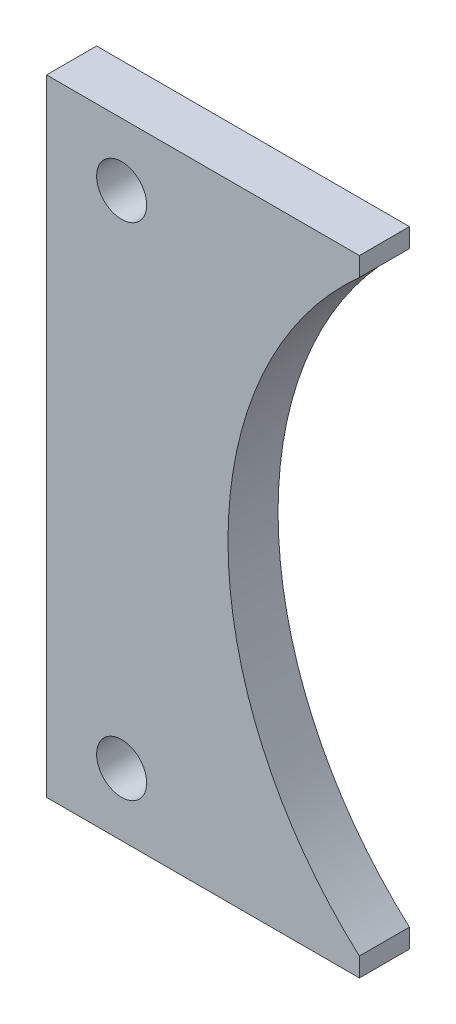
ISO-10303-21;
HEADER;
FILE_DESCRIPTION(('STEP AP214'),'2;1');
FILE_NAME('part.step','',(''),(''),'','','');
FILE_SCHEMA(('AUTOMOTIVE_DESIGN { 1 0 10303 214 1 1 1 1 }'));
ENDSEC;
DATA;
#1=APPLICATION_CONTEXT('core data for automotive mechanical design processes');
#2=APPLICATION_PROTOCOL_DEFINITION('international standard','automotive_design',2000,#1);
#3=PRODUCT_CONTEXT('',#1,'mechanical');
#4=PRODUCT('Part','Part','',(#3));
#5=PRODUCT_RELATED_PRODUCT_CATEGORY('part','',(#4));
#6=PRODUCT_DEFINITION_FORMATION('','',#4);
#7=PRODUCT_DEFINITION_CONTEXT('part definition',#1,'design');
#8=PRODUCT_DEFINITION('design','',#6,#7);
#9=PRODUCT_DEFINITION_SHAPE('','',#8);
#10=(LENGTH_UNIT() NAMED_UNIT(*) SI_UNIT(.MILLI.,.METRE.));
#11=(NAMED_UNIT(*) PLANE_ANGLE_UNIT() SI_UNIT($,.RADIAN.));
#12=(NAMED_UNIT(*) SI_UNIT($,.STERADIAN.) SOLID_ANGLE_UNIT());
#13=UNCERTAINTY_MEASURE_WITH_UNIT(LENGTH_MEASURE(1.E-05),#10,'distance_accuracy_value','');
#14=(GEOMETRIC_REPRESENTATION_CONTEXT(3) GLOBAL_UNCERTAINTY_ASSIGNED_CONTEXT((#13)) GLOBAL_UNIT_ASSIGNED_CONTEXT((#10,
#11,#12)) REPRESENTATION_CONTEXT('',''));
#15=CARTESIAN_POINT('',(0.,0.,0.));
#16=DIRECTION('',(0.,0.,1.));
#17=DIRECTION('',(1.,0.,0.));
#18=AXIS2_PLACEMENT_3D('',#15,#16,#17);
#19=CARTESIAN_POINT('',(0.,0.,4.));
#20=DIRECTION('',(0.,0.,-1.));
#21=DIRECTION('',(-1.,0.,0.));
#22=AXIS2_PLACEMENT_3D('',#19,#20,#21);
#23=PLANE('',#22);
#24=DIRECTION('',(0.,-1.,0.));
#25=VECTOR('',#24,1.);
#26=CARTESIAN_POINT('',(-46.,25.,4.));
#27=LINE('',#26,#25);
#28=CARTESIAN_POINT('',(-46.,25.,4.));
#29=VERTEX_POINT('',#28);
#30=CARTESIAN_POINT('',(-46.,-25.,4.));
#31=VERTEX_POINT('',#30);
#32=EDGE_CURVE('E146',#29,#31,#27,.T.);
#33=ORIENTED_EDGE('',*,*,#32,.T.);
#34=DIRECTION('',(1.,0.,0.));
#35=VECTOR('',#34,1.);
#36=CARTESIAN_POINT('',(-46.,-25.,4.));
#37=LINE('',#36,#35);
#38=CARTESIAN_POINT('',(-21.,-25.,4.));
#39=VERTEX_POINT('',#38);
#40=EDGE_CURVE('E94',#31,#39,#37,.T.);
#41=ORIENTED_EDGE('',*,*,#40,.T.);
#42=DIRECTION('',(0.,1.,0.));
#43=VECTOR('',#42,1.);
#44=CARTESIAN_POINT('',(-21.,-23.4787137637478,4.));
#45=LINE('',#44,#43);
#46=CARTESIAN_POINT('',(-21.,-23.4787137637478,4.));
#47=VERTEX_POINT('',#46);
#48=EDGE_CURVE('E107',#39,#47,#45,.T.);
#49=ORIENTED_EDGE('',*,*,#48,.T.);
#50=CARTESIAN_POINT('',(0.,0.,4.));
#51=DIRECTION('',(0.,0.,-1.));
#52=DIRECTION('',(-1.,0.,0.));
#53=AXIS2_PLACEMENT_3D('',#50,#51,#52);
#54=CIRCLE('',#53,31.5);
#55=CARTESIAN_POINT('',(-21.,23.4787137637478,4.));
#56=VERTEX_POINT('',#55);
#57=EDGE_CURVE('E101',#47,#56,#54,.T.);
#58=ORIENTED_EDGE('',*,*,#57,.T.);
#59=DIRECTION('',(0.,1.,0.));
#60=VECTOR('',#59,1.);
#61=CARTESIAN_POINT('',(-21.,23.4787137637478,4.));
#62=LINE('',#61,#60);
#63=CARTESIAN_POINT('',(-21.,25.,4.));
#64=VERTEX_POINT('',#63);
#65=EDGE_CURVE('E105',#56,#64,#62,.T.);
#66=ORIENTED_EDGE('',*,*,#65,.T.);
#67=DIRECTION('',(-1.,0.,0.));
#68=VECTOR('',#67,1.);
#69=CARTESIAN_POINT('',(-46.,25.,4.));
#70=LINE('',#69,#68);
#71=EDGE_CURVE('E57',#64,#29,#70,.T.);
#72=ORIENTED_EDGE('',*,*,#71,.T.);
#73=EDGE_LOOP('',(#33,#41,#49,#58,#66,#72));
#74=FACE_BOUND('',#73,.T.);
#75=CARTESIAN_POINT('',(-40.,20.,4.));
#76=DIRECTION('',(0.,0.,1.));
#77=DIRECTION('',(1.,0.,0.));
#78=AXIS2_PLACEMENT_3D('',#75,#76,#77);
#79=CIRCLE('',#78,2.);
#80=CARTESIAN_POINT('',(-38.,20.,4.));
#81=VERTEX_POINT('',#80);
#82=EDGE_CURVE('E134',#81,#81,#79,.T.);
#83=ORIENTED_EDGE('',*,*,#82,.F.);
#84=EDGE_LOOP('',(#83));
#85=FACE_BOUND('',#84,.T.);
#86=CARTESIAN_POINT('',(-40.,-20.,4.));
#87=DIRECTION('',(0.,0.,1.));
#88=DIRECTION('',(1.,0.,0.));
#89=AXIS2_PLACEMENT_3D('',#86,#87,#88);
#90=CIRCLE('',#89,2.);
#91=CARTESIAN_POINT('',(-38.,-20.,4.));
#92=VERTEX_POINT('',#91);
#93=EDGE_CURVE('E191',#92,#92,#90,.T.);
#94=ORIENTED_EDGE('',*,*,#93,.F.);
#95=EDGE_LOOP('',(#94));
#96=FACE_BOUND('',#95,.T.);
#97=ADVANCED_FACE('F39',(#74,#85,#96),#23,.F.);
#98=CARTESIAN_POINT('',(0.,0.,0.));
#99=DIRECTION('',(0.,0.,-1.));
#100=DIRECTION('',(-1.,0.,0.));
#101=AXIS2_PLACEMENT_3D('',#98,#99,#100);
#102=PLANE('',#101);
#103=CARTESIAN_POINT('',(-40.,20.,0.));
#104=DIRECTION('',(0.,0.,1.));
#105=DIRECTION('',(1.,0.,0.));
#106=AXIS2_PLACEMENT_3D('',#103,#104,#105);
#107=CIRCLE('',#106,2.);
#108=CARTESIAN_POINT('',(-38.,20.,0.));
#109=VERTEX_POINT('',#108);
#110=EDGE_CURVE('E198',#109,#109,#107,.T.);
#111=ORIENTED_EDGE('',*,*,#110,.T.);
#112=EDGE_LOOP('',(#111));
#113=FACE_BOUND('',#112,.T.);
#114=DIRECTION('',(0.,-1.,0.));
#115=VECTOR('',#114,1.);
#116=CARTESIAN_POINT('',(-46.,25.,0.));
#117=LINE('',#116,#115);
#118=CARTESIAN_POINT('',(-46.,25.,0.));
#119=VERTEX_POINT('',#118);
#120=CARTESIAN_POINT('',(-46.,-25.,0.));
#121=VERTEX_POINT('',#120);
#122=EDGE_CURVE('E129',#119,#121,#117,.T.);
#123=ORIENTED_EDGE('',*,*,#122,.F.);
#124=DIRECTION('',(-1.,0.,0.));
#125=VECTOR('',#124,1.);
#126=CARTESIAN_POINT('',(-46.,25.,0.));
#127=LINE('',#126,#125);
#128=CARTESIAN_POINT('',(-21.,25.,0.));
#129=VERTEX_POINT('',#128);
#130=EDGE_CURVE('E86',#129,#119,#127,.T.);
#131=ORIENTED_EDGE('',*,*,#130,.F.);
#132=DIRECTION('',(0.,1.,0.));
#133=VECTOR('',#132,1.);
#134=CARTESIAN_POINT('',(-21.,23.4787137637478,0.));
#135=LINE('',#134,#133);
#136=CARTESIAN_POINT('',(-21.,23.4787137637478,0.));
#137=VERTEX_POINT('',#136);
#138=EDGE_CURVE('E80',#137,#129,#135,.T.);
#139=ORIENTED_EDGE('',*,*,#138,.F.);
#140=CARTESIAN_POINT('',(0.,0.,0.));
#141=DIRECTION('',(0.,0.,-1.));
#142=DIRECTION('',(-1.,0.,0.));
#143=AXIS2_PLACEMENT_3D('',#140,#141,#142);
#144=CIRCLE('',#143,31.5);
#145=CARTESIAN_POINT('',(-21.,-23.4787137637478,0.));
#146=VERTEX_POINT('',#145);
#147=EDGE_CURVE('E116',#146,#137,#144,.T.);
#148=ORIENTED_EDGE('',*,*,#147,.F.);
#149=DIRECTION('',(0.,1.,0.));
#150=VECTOR('',#149,1.);
#151=CARTESIAN_POINT('',(-21.,-23.4787137637478,0.));
#152=LINE('',#151,#150);
#153=CARTESIAN_POINT('',(-21.,-25.,0.));
#154=VERTEX_POINT('',#153);
#155=EDGE_CURVE('E137',#154,#146,#152,.T.);
#156=ORIENTED_EDGE('',*,*,#155,.F.);
#157=DIRECTION('',(1.,0.,0.));
#158=VECTOR('',#157,1.);
#159=CARTESIAN_POINT('',(-46.,-25.,0.));
#160=LINE('',#159,#158);
#161=EDGE_CURVE('E133',#121,#154,#160,.T.);
#162=ORIENTED_EDGE('',*,*,#161,.F.);
#163=EDGE_LOOP('',(#123,#131,#139,#148,#156,#162));
#164=FACE_BOUND('',#163,.T.);
#165=CARTESIAN_POINT('',(-40.,-20.,0.));
#166=DIRECTION('',(0.,0.,1.));
#167=DIRECTION('',(1.,0.,0.));
#168=AXIS2_PLACEMENT_3D('',#165,#166,#167);
#169=CIRCLE('',#168,2.);
#170=CARTESIAN_POINT('',(-38.,-20.,0.));
#171=VERTEX_POINT('',#170);
#172=EDGE_CURVE('E194',#171,#171,#169,.T.);
#173=ORIENTED_EDGE('',*,*,#172,.T.);
#174=EDGE_LOOP('',(#173));
#175=FACE_BOUND('',#174,.T.);
#176=ADVANCED_FACE('F159',(#113,#164,#175),#102,.T.);
#177=CARTESIAN_POINT('',(-46.,25.,4.));
#178=DIRECTION('',(1.,0.,0.));
#179=DIRECTION('',(0.,0.,-1.));
#180=AXIS2_PLACEMENT_3D('',#177,#178,#179);
#181=PLANE('',#180);
#182=ORIENTED_EDGE('',*,*,#122,.T.);
#183=DIRECTION('',(0.,0.,-1.));
#184=VECTOR('',#183,1.);
#185=CARTESIAN_POINT('',(-46.,-25.,4.));
#186=LINE('',#185,#184);
#187=EDGE_CURVE('E11',#31,#121,#186,.T.);
#188=ORIENTED_EDGE('',*,*,#187,.F.);
#189=ORIENTED_EDGE('',*,*,#32,.F.);
#190=DIRECTION('',(0.,0.,-1.));
#191=VECTOR('',#190,1.);
#192=CARTESIAN_POINT('',(-46.,25.,4.));
#193=LINE('',#192,#191);
#194=EDGE_CURVE('E125',#29,#119,#193,.T.);
#195=ORIENTED_EDGE('',*,*,#194,.T.);
#196=EDGE_LOOP('',(#182,#188,#189,#195));
#197=FACE_BOUND('',#196,.T.);
#198=ADVANCED_FACE('F41',(#197),#181,.F.);
#199=CARTESIAN_POINT('',(-46.,-25.,4.));
#200=DIRECTION('',(0.,1.,0.));
#201=DIRECTION('',(0.,0.,1.));
#202=AXIS2_PLACEMENT_3D('',#199,#200,#201);
#203=PLANE('',#202);
#204=ORIENTED_EDGE('',*,*,#161,.T.);
#205=DIRECTION('',(0.,0.,-1.));
#206=VECTOR('',#205,1.);
#207=CARTESIAN_POINT('',(-21.,-25.,4.));
#208=LINE('',#207,#206);
#209=EDGE_CURVE('E49',#39,#154,#208,.T.);
#210=ORIENTED_EDGE('',*,*,#209,.F.);
#211=ORIENTED_EDGE('',*,*,#40,.F.);
#212=ORIENTED_EDGE('',*,*,#187,.T.);
#213=EDGE_LOOP('',(#204,#210,#211,#212));
#214=FACE_BOUND('',#213,.T.);
#215=ADVANCED_FACE('F246',(#214),#203,.F.);
#216=CARTESIAN_POINT('',(-21.,-23.4787137637478,4.));
#217=DIRECTION('',(-1.,0.,0.));
#218=DIRECTION('',(0.,0.,1.));
#219=AXIS2_PLACEMENT_3D('',#216,#217,#218);
#220=PLANE('',#219);
#221=ORIENTED_EDGE('',*,*,#155,.T.);
#222=DIRECTION('',(0.,0.,-1.));
#223=VECTOR('',#222,1.);
#224=CARTESIAN_POINT('',(-21.,-23.4787137637478,4.));
#225=LINE('',#224,#223);
#226=EDGE_CURVE('E118',#47,#146,#225,.T.);
#227=ORIENTED_EDGE('',*,*,#226,.F.);
#228=ORIENTED_EDGE('',*,*,#48,.F.);
#229=ORIENTED_EDGE('',*,*,#209,.T.);
#230=EDGE_LOOP('',(#221,#227,#228,#229));
#231=FACE_BOUND('',#230,.T.);
#232=ADVANCED_FACE('F156',(#231),#220,.F.);
#233=CARTESIAN_POINT('',(0.,0.,4.));
#234=DIRECTION('',(0.,0.,-1.));
#235=DIRECTION('',(-1.,0.,0.));
#236=AXIS2_PLACEMENT_3D('',#233,#234,#235);
#237=CYLINDRICAL_SURFACE('',#236,31.5);
#238=ORIENTED_EDGE('',*,*,#147,.T.);
#239=DIRECTION('',(0.,0.,-1.));
#240=VECTOR('',#239,1.);
#241=CARTESIAN_POINT('',(-21.,23.4787137637478,4.));
#242=LINE('',#241,#240);
#243=EDGE_CURVE('E113',#56,#137,#242,.T.);
#244=ORIENTED_EDGE('',*,*,#243,.F.);
#245=ORIENTED_EDGE('',*,*,#57,.F.);
#246=ORIENTED_EDGE('',*,*,#226,.T.);
#247=EDGE_LOOP('',(#238,#244,#245,#246));
#248=FACE_BOUND('',#247,.T.);
#249=ADVANCED_FACE('F114',(#248),#237,.F.);
#250=CARTESIAN_POINT('',(-21.,23.4787137637478,4.));
#251=DIRECTION('',(-1.,0.,0.));
#252=DIRECTION('',(0.,-1.,0.));
#253=AXIS2_PLACEMENT_3D('',#250,#251,#252);
#254=PLANE('',#253);
#255=ORIENTED_EDGE('',*,*,#138,.T.);
#256=DIRECTION('',(0.,0.,-1.));
#257=VECTOR('',#256,1.);
#258=CARTESIAN_POINT('',(-21.,25.,4.));
#259=LINE('',#258,#257);
#260=EDGE_CURVE('E119',#64,#129,#259,.T.);
#261=ORIENTED_EDGE('',*,*,#260,.F.);
#262=ORIENTED_EDGE('',*,*,#65,.F.);
#263=ORIENTED_EDGE('',*,*,#243,.T.);
#264=EDGE_LOOP('',(#255,#261,#262,#263));
#265=FACE_BOUND('',#264,.T.);
#266=ADVANCED_FACE('F121',(#265),#254,.F.);
#267=CARTESIAN_POINT('',(-46.,25.,4.));
#268=DIRECTION('',(0.,-1.,0.));
#269=DIRECTION('',(0.,0.,-1.));
#270=AXIS2_PLACEMENT_3D('',#267,#268,#269);
#271=PLANE('',#270);
#272=ORIENTED_EDGE('',*,*,#130,.T.);
#273=ORIENTED_EDGE('',*,*,#194,.F.);
#274=ORIENTED_EDGE('',*,*,#71,.F.);
#275=ORIENTED_EDGE('',*,*,#260,.T.);
#276=EDGE_LOOP('',(#272,#273,#274,#275));
#277=FACE_BOUND('',#276,.T.);
#278=ADVANCED_FACE('F164',(#277),#271,.F.);
#279=CARTESIAN_POINT('',(-40.,20.,4.));
#280=DIRECTION('',(0.,0.,-1.));
#281=DIRECTION('',(-1.,0.,0.));
#282=AXIS2_PLACEMENT_3D('',#279,#280,#281);
#283=CYLINDRICAL_SURFACE('',#282,2.);
#284=ORIENTED_EDGE('',*,*,#82,.T.);
#285=EDGE_LOOP('',(#284));
#286=FACE_BOUND('',#285,.T.);
#287=ORIENTED_EDGE('',*,*,#110,.F.);
#288=EDGE_LOOP('',(#287));
#289=FACE_BOUND('',#288,.T.);
#290=ADVANCED_FACE('F166',(#286,#289),#283,.F.);
#291=CARTESIAN_POINT('',(-40.,-20.,4.));
#292=DIRECTION('',(0.,0.,-1.));
#293=DIRECTION('',(-1.,0.,0.));
#294=AXIS2_PLACEMENT_3D('',#291,#292,#293);
#295=CYLINDRICAL_SURFACE('',#294,2.);
#296=ORIENTED_EDGE('',*,*,#93,.T.);
#297=EDGE_LOOP('',(#296));
#298=FACE_BOUND('',#297,.T.);
#299=ORIENTED_EDGE('',*,*,#172,.F.);
#300=EDGE_LOOP('',(#299));
#301=FACE_BOUND('',#300,.T.);
#302=ADVANCED_FACE('F172',(#298,#301),#295,.F.);
#303=CLOSED_SHELL('',(#97,#176,#198,#215,#232,#249,#266,#278,#290,#302));
#304=MANIFOLD_SOLID_BREP('B2',#303);
#305=ADVANCED_BREP_SHAPE_REPRESENTATION('',(#18,#304),#14);
#306=SHAPE_DEFINITION_REPRESENTATION(#9,#305);
ENDSEC;
END-ISO-10303-21;
